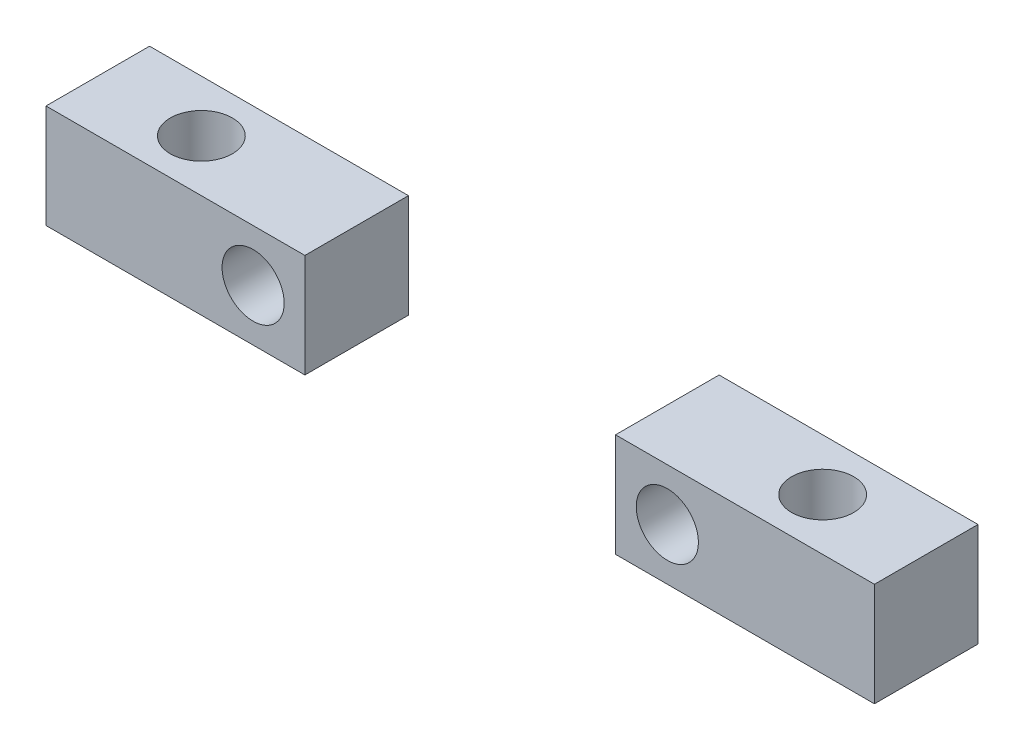
ISO-10303-21;
HEADER;
FILE_DESCRIPTION(('STEP AP214'),'2;1');
FILE_NAME('part.step','',(''),(''),'','','');
FILE_SCHEMA(('AUTOMOTIVE_DESIGN { 1 0 10303 214 1 1 1 1 }'));
ENDSEC;
DATA;
#1=APPLICATION_CONTEXT('core data for automotive mechanical design processes');
#2=APPLICATION_PROTOCOL_DEFINITION('international standard','automotive_design',2000,#1);
#3=PRODUCT_CONTEXT('',#1,'mechanical');
#4=PRODUCT('Part','Part','',(#3));
#5=PRODUCT_RELATED_PRODUCT_CATEGORY('part','',(#4));
#6=PRODUCT_DEFINITION_FORMATION('','',#4);
#7=PRODUCT_DEFINITION_CONTEXT('part definition',#1,'design');
#8=PRODUCT_DEFINITION('design','',#6,#7);
#9=PRODUCT_DEFINITION_SHAPE('','',#8);
#10=(LENGTH_UNIT() NAMED_UNIT(*) SI_UNIT(.MILLI.,.METRE.));
#11=(NAMED_UNIT(*) PLANE_ANGLE_UNIT() SI_UNIT($,.RADIAN.));
#12=(NAMED_UNIT(*) SI_UNIT($,.STERADIAN.) SOLID_ANGLE_UNIT());
#13=UNCERTAINTY_MEASURE_WITH_UNIT(LENGTH_MEASURE(1.E-05),#10,'distance_accuracy_value','');
#14=(GEOMETRIC_REPRESENTATION_CONTEXT(3) GLOBAL_UNCERTAINTY_ASSIGNED_CONTEXT((#13)) GLOBAL_UNIT_ASSIGNED_CONTEXT((#10,
#11,#12)) REPRESENTATION_CONTEXT('',''));
#15=CARTESIAN_POINT('',(0.,0.,0.));
#16=DIRECTION('',(0.,0.,1.));
#17=DIRECTION('',(1.,0.,0.));
#18=AXIS2_PLACEMENT_3D('',#15,#16,#17);
#19=CARTESIAN_POINT('',(-40.,10.,0.));
#20=DIRECTION('',(0.,0.,-1.));
#21=DIRECTION('',(-1.,0.,0.));
#22=AXIS2_PLACEMENT_3D('',#19,#20,#21);
#23=PLANE('',#22);
#24=CARTESIAN_POINT('',(-20.,4.99999999999972,0.));
#25=DIRECTION('',(0.,0.,1.));
#26=DIRECTION('',(1.,0.,0.));
#27=AXIS2_PLACEMENT_3D('',#24,#25,#26);
#28=CIRCLE('',#27,3.);
#29=CARTESIAN_POINT('',(-17.,4.99999999999972,0.));
#30=VERTEX_POINT('',#29);
#31=EDGE_CURVE('E114',#30,#30,#28,.T.);
#32=ORIENTED_EDGE('',*,*,#31,.F.);
#33=EDGE_LOOP('',(#32));
#34=FACE_BOUND('',#33,.T.);
#35=DIRECTION('',(1.,0.,0.));
#36=VECTOR('',#35,1.);
#37=CARTESIAN_POINT('',(-40.,0.,0.));
#38=LINE('',#37,#36);
#39=CARTESIAN_POINT('',(-40.,0.,0.));
#40=VERTEX_POINT('',#39);
#41=CARTESIAN_POINT('',(-15.,0.,0.));
#42=VERTEX_POINT('',#41);
#43=EDGE_CURVE('E45',#40,#42,#38,.T.);
#44=ORIENTED_EDGE('',*,*,#43,.T.);
#45=DIRECTION('',(0.,-1.,0.));
#46=VECTOR('',#45,1.);
#47=CARTESIAN_POINT('',(-15.,16.4217024320037,0.));
#48=LINE('',#47,#46);
#49=CARTESIAN_POINT('',(-15.,10.,0.));
#50=VERTEX_POINT('',#49);
#51=EDGE_CURVE('E12',#50,#42,#48,.T.);
#52=ORIENTED_EDGE('',*,*,#51,.F.);
#53=DIRECTION('',(1.,0.,0.));
#54=VECTOR('',#53,1.);
#55=CARTESIAN_POINT('',(-40.,10.,0.));
#56=LINE('',#55,#54);
#57=CARTESIAN_POINT('',(-40.,10.,0.));
#58=VERTEX_POINT('',#57);
#59=EDGE_CURVE('E87',#58,#50,#56,.T.);
#60=ORIENTED_EDGE('',*,*,#59,.F.);
#61=DIRECTION('',(0.,-1.,0.));
#62=VECTOR('',#61,1.);
#63=CARTESIAN_POINT('',(-40.,10.,0.));
#64=LINE('',#63,#62);
#65=EDGE_CURVE('E110',#58,#40,#64,.T.);
#66=ORIENTED_EDGE('',*,*,#65,.T.);
#67=EDGE_LOOP('',(#44,#52,#60,#66));
#68=FACE_BOUND('',#67,.T.);
#69=ADVANCED_FACE('F42',(#34,#68),#23,.F.);
#70=CARTESIAN_POINT('',(-40.,10.,-9.99999999999999));
#71=DIRECTION('',(0.,0.,1.));
#72=DIRECTION('',(1.,0.,0.));
#73=AXIS2_PLACEMENT_3D('',#70,#71,#72);
#74=PLANE('',#73);
#75=CARTESIAN_POINT('',(-20.,4.99999999999972,-9.99999999999999));
#76=DIRECTION('',(0.,0.,1.));
#77=DIRECTION('',(1.,0.,0.));
#78=AXIS2_PLACEMENT_3D('',#75,#76,#77);
#79=CIRCLE('',#78,3.);
#80=CARTESIAN_POINT('',(-17.,4.99999999999972,-9.99999999999999));
#81=VERTEX_POINT('',#80);
#82=EDGE_CURVE('E108',#81,#81,#79,.T.);
#83=ORIENTED_EDGE('',*,*,#82,.T.);
#84=EDGE_LOOP('',(#83));
#85=FACE_BOUND('',#84,.T.);
#86=DIRECTION('',(-1.,0.,0.));
#87=VECTOR('',#86,1.);
#88=CARTESIAN_POINT('',(-40.,10.,-9.99999999999999));
#89=LINE('',#88,#87);
#90=CARTESIAN_POINT('',(-15.,10.,-9.99999999999999));
#91=VERTEX_POINT('',#90);
#92=CARTESIAN_POINT('',(-40.,10.,-9.99999999999999));
#93=VERTEX_POINT('',#92);
#94=EDGE_CURVE('E99',#91,#93,#89,.T.);
#95=ORIENTED_EDGE('',*,*,#94,.F.);
#96=DIRECTION('',(0.,-1.,0.));
#97=VECTOR('',#96,1.);
#98=CARTESIAN_POINT('',(-15.,16.4217024320037,-9.99999999999999));
#99=LINE('',#98,#97);
#100=CARTESIAN_POINT('',(-15.,0.,-9.99999999999999));
#101=VERTEX_POINT('',#100);
#102=EDGE_CURVE('E59',#91,#101,#99,.T.);
#103=ORIENTED_EDGE('',*,*,#102,.T.);
#104=DIRECTION('',(-1.,0.,0.));
#105=VECTOR('',#104,1.);
#106=CARTESIAN_POINT('',(-40.,0.,-9.99999999999999));
#107=LINE('',#106,#105);
#108=CARTESIAN_POINT('',(-40.,0.,-9.99999999999999));
#109=VERTEX_POINT('',#108);
#110=EDGE_CURVE('E103',#101,#109,#107,.T.);
#111=ORIENTED_EDGE('',*,*,#110,.T.);
#112=DIRECTION('',(0.,-1.,0.));
#113=VECTOR('',#112,1.);
#114=CARTESIAN_POINT('',(-40.,10.,-9.99999999999999));
#115=LINE('',#114,#113);
#116=EDGE_CURVE('E117',#93,#109,#115,.T.);
#117=ORIENTED_EDGE('',*,*,#116,.F.);
#118=EDGE_LOOP('',(#95,#103,#111,#117));
#119=FACE_BOUND('',#118,.T.);
#120=ADVANCED_FACE('F129',(#85,#119),#74,.F.);
#121=CARTESIAN_POINT('',(-40.,10.,0.));
#122=DIRECTION('',(0.,1.,0.));
#123=DIRECTION('',(0.,0.,1.));
#124=AXIS2_PLACEMENT_3D('',#121,#122,#123);
#125=PLANE('',#124);
#126=DIRECTION('',(0.,0.,1.));
#127=VECTOR('',#126,1.);
#128=CARTESIAN_POINT('',(-15.,10.,0.));
#129=LINE('',#128,#127);
#130=EDGE_CURVE('E51',#91,#50,#129,.T.);
#131=ORIENTED_EDGE('',*,*,#130,.F.);
#132=ORIENTED_EDGE('',*,*,#94,.T.);
#133=DIRECTION('',(0.,0.,1.));
#134=VECTOR('',#133,1.);
#135=CARTESIAN_POINT('',(-40.,10.,-9.99999999999999));
#136=LINE('',#135,#134);
#137=EDGE_CURVE('E92',#93,#58,#136,.T.);
#138=ORIENTED_EDGE('',*,*,#137,.T.);
#139=ORIENTED_EDGE('',*,*,#59,.T.);
#140=EDGE_LOOP('',(#131,#132,#138,#139));
#141=FACE_BOUND('',#140,.T.);
#142=CARTESIAN_POINT('',(-30.,10.,-4.99999999999957));
#143=DIRECTION('',(0.,1.,0.));
#144=DIRECTION('',(0.,0.,1.));
#145=AXIS2_PLACEMENT_3D('',#142,#143,#144);
#146=CIRCLE('',#145,3.);
#147=CARTESIAN_POINT('',(-30.,10.,-1.99999999999957));
#148=VERTEX_POINT('',#147);
#149=EDGE_CURVE('E82',#148,#148,#146,.T.);
#150=ORIENTED_EDGE('',*,*,#149,.F.);
#151=EDGE_LOOP('',(#150));
#152=FACE_BOUND('',#151,.T.);
#153=ADVANCED_FACE('F89',(#141,#152),#125,.T.);
#154=CARTESIAN_POINT('',(-40.,0.,0.));
#155=DIRECTION('',(0.,1.,0.));
#156=DIRECTION('',(0.,0.,1.));
#157=AXIS2_PLACEMENT_3D('',#154,#155,#156);
#158=PLANE('',#157);
#159=CARTESIAN_POINT('',(-30.,0.,-4.99999999999957));
#160=DIRECTION('',(0.,1.,0.));
#161=DIRECTION('',(0.,0.,1.));
#162=AXIS2_PLACEMENT_3D('',#159,#160,#161);
#163=CIRCLE('',#162,3.);
#164=CARTESIAN_POINT('',(-30.,0.,-1.99999999999957));
#165=VERTEX_POINT('',#164);
#166=EDGE_CURVE('E94',#165,#165,#163,.T.);
#167=ORIENTED_EDGE('',*,*,#166,.T.);
#168=EDGE_LOOP('',(#167));
#169=FACE_BOUND('',#168,.T.);
#170=ORIENTED_EDGE('',*,*,#110,.F.);
#171=DIRECTION('',(0.,0.,1.));
#172=VECTOR('',#171,1.);
#173=CARTESIAN_POINT('',(-15.,0.,0.));
#174=LINE('',#173,#172);
#175=EDGE_CURVE('E97',#101,#42,#174,.T.);
#176=ORIENTED_EDGE('',*,*,#175,.T.);
#177=ORIENTED_EDGE('',*,*,#43,.F.);
#178=DIRECTION('',(0.,0.,1.));
#179=VECTOR('',#178,1.);
#180=CARTESIAN_POINT('',(-40.,0.,-9.99999999999999));
#181=LINE('',#180,#179);
#182=EDGE_CURVE('E119',#109,#40,#181,.T.);
#183=ORIENTED_EDGE('',*,*,#182,.F.);
#184=EDGE_LOOP('',(#170,#176,#177,#183));
#185=FACE_BOUND('',#184,.T.);
#186=ADVANCED_FACE('F125',(#169,#185),#158,.F.);
#187=CARTESIAN_POINT('',(-40.,10.,-9.99999999999999));
#188=DIRECTION('',(1.,0.,0.));
#189=DIRECTION('',(0.,0.,-1.));
#190=AXIS2_PLACEMENT_3D('',#187,#188,#189);
#191=PLANE('',#190);
#192=ORIENTED_EDGE('',*,*,#182,.T.);
#193=ORIENTED_EDGE('',*,*,#65,.F.);
#194=ORIENTED_EDGE('',*,*,#137,.F.);
#195=ORIENTED_EDGE('',*,*,#116,.T.);
#196=EDGE_LOOP('',(#192,#193,#194,#195));
#197=FACE_BOUND('',#196,.T.);
#198=ADVANCED_FACE('F128',(#197),#191,.F.);
#199=CARTESIAN_POINT('',(-20.,4.99999999999972,-9.99999999999999));
#200=DIRECTION('',(0.,0.,1.));
#201=DIRECTION('',(1.,0.,0.));
#202=AXIS2_PLACEMENT_3D('',#199,#200,#201);
#203=CYLINDRICAL_SURFACE('',#202,3.);
#204=CARTESIAN_POINT('',(-17.,4.99999999999972,-9.99999999999999));
#205=CARTESIAN_POINT('',(-17.,4.99999999999972,-9.89583333333332));
#206=CARTESIAN_POINT('',(-17.,4.99999999999972,-9.79166666666666));
#207=CARTESIAN_POINT('',(-17.,4.99999999999972,-9.58333333333332));
#208=CARTESIAN_POINT('',(-17.,4.99999999999972,-9.47916666666666));
#209=CARTESIAN_POINT('',(-17.,4.99999999999972,-9.27083333333332));
#210=CARTESIAN_POINT('',(-17.,4.99999999999972,-9.16666666666666));
#211=CARTESIAN_POINT('',(-17.,4.99999999999972,-8.95833333333332));
#212=CARTESIAN_POINT('',(-17.,4.99999999999972,-8.85416666666666));
#213=CARTESIAN_POINT('',(-17.,4.99999999999972,-8.64583333333332));
#214=CARTESIAN_POINT('',(-17.,4.99999999999972,-8.54166666666666));
#215=CARTESIAN_POINT('',(-17.,4.99999999999972,-8.33333333333333));
#216=CARTESIAN_POINT('',(-17.,4.99999999999972,-8.22916666666666));
#217=CARTESIAN_POINT('',(-17.,4.99999999999972,-8.02083333333333));
#218=CARTESIAN_POINT('',(-17.,4.99999999999972,-7.91666666666666));
#219=CARTESIAN_POINT('',(-17.,4.99999999999972,-7.70833333333333));
#220=CARTESIAN_POINT('',(-17.,4.99999999999972,-7.60416666666666));
#221=CARTESIAN_POINT('',(-17.,4.99999999999972,-7.39583333333333));
#222=CARTESIAN_POINT('',(-17.,4.99999999999972,-7.29166666666666));
#223=CARTESIAN_POINT('',(-17.,4.99999999999972,-7.08333333333333));
#224=CARTESIAN_POINT('',(-17.,4.99999999999972,-6.97916666666666));
#225=CARTESIAN_POINT('',(-17.,4.99999999999972,-6.77083333333333));
#226=CARTESIAN_POINT('',(-17.,4.99999999999972,-6.66666666666666));
#227=CARTESIAN_POINT('',(-17.,4.99999999999972,-6.45833333333333));
#228=CARTESIAN_POINT('',(-17.,4.99999999999972,-6.35416666666666));
#229=CARTESIAN_POINT('',(-17.,4.99999999999972,-6.14583333333333));
#230=CARTESIAN_POINT('',(-17.,4.99999999999972,-6.04166666666666));
#231=CARTESIAN_POINT('',(-17.,4.99999999999972,-5.83333333333333));
#232=CARTESIAN_POINT('',(-17.,4.99999999999972,-5.72916666666666));
#233=CARTESIAN_POINT('',(-17.,4.99999999999972,-5.52083333333333));
#234=CARTESIAN_POINT('',(-17.,4.99999999999972,-5.41666666666666));
#235=CARTESIAN_POINT('',(-17.,4.99999999999972,-5.20833333333333));
#236=CARTESIAN_POINT('',(-17.,4.99999999999972,-5.10416666666666));
#237=CARTESIAN_POINT('',(-17.,4.99999999999972,-4.89583333333333));
#238=CARTESIAN_POINT('',(-17.,4.99999999999972,-4.79166666666666));
#239=CARTESIAN_POINT('',(-17.,4.99999999999972,-4.58333333333333));
#240=CARTESIAN_POINT('',(-17.,4.99999999999972,-4.47916666666666));
#241=CARTESIAN_POINT('',(-17.,4.99999999999972,-4.27083333333333));
#242=CARTESIAN_POINT('',(-17.,4.99999999999972,-4.16666666666666));
#243=CARTESIAN_POINT('',(-17.,4.99999999999972,-3.95833333333333));
#244=CARTESIAN_POINT('',(-17.,4.99999999999972,-3.85416666666666));
#245=CARTESIAN_POINT('',(-17.,4.99999999999972,-3.64583333333333));
#246=CARTESIAN_POINT('',(-17.,4.99999999999972,-3.54166666666666));
#247=CARTESIAN_POINT('',(-17.,4.99999999999972,-3.33333333333333));
#248=CARTESIAN_POINT('',(-17.,4.99999999999972,-3.22916666666666));
#249=CARTESIAN_POINT('',(-17.,4.99999999999972,-3.02083333333333));
#250=CARTESIAN_POINT('',(-17.,4.99999999999972,-2.91666666666666));
#251=CARTESIAN_POINT('',(-17.,4.99999999999972,-2.70833333333333));
#252=CARTESIAN_POINT('',(-17.,4.99999999999972,-2.60416666666666));
#253=CARTESIAN_POINT('',(-17.,4.99999999999972,-2.39583333333333));
#254=CARTESIAN_POINT('',(-17.,4.99999999999972,-2.29166666666666));
#255=CARTESIAN_POINT('',(-17.,4.99999999999972,-2.08333333333333));
#256=CARTESIAN_POINT('',(-17.,4.99999999999972,-1.97916666666667));
#257=CARTESIAN_POINT('',(-17.,4.99999999999972,-1.77083333333333));
#258=CARTESIAN_POINT('',(-17.,4.99999999999972,-1.66666666666667));
#259=CARTESIAN_POINT('',(-17.,4.99999999999972,-1.45833333333333));
#260=CARTESIAN_POINT('',(-17.,4.99999999999972,-1.35416666666667));
#261=CARTESIAN_POINT('',(-17.,4.99999999999972,-1.14583333333333));
#262=CARTESIAN_POINT('',(-17.,4.99999999999972,-1.04166666666667));
#263=CARTESIAN_POINT('',(-17.,4.99999999999972,-0.833333333333334));
#264=CARTESIAN_POINT('',(-17.,4.99999999999972,-0.729166666666667));
#265=CARTESIAN_POINT('',(-17.,4.99999999999972,-0.520833333333334));
#266=CARTESIAN_POINT('',(-17.,4.99999999999972,-0.416666666666668));
#267=CARTESIAN_POINT('',(-17.,4.99999999999972,-0.208333333333335));
#268=CARTESIAN_POINT('',(-17.,4.99999999999972,-0.104166666666668));
#269=CARTESIAN_POINT('',(-17.,4.99999999999972,0.));
#270=B_SPLINE_CURVE_WITH_KNOTS('',3,(#204,#205,#206,#207,#208,#209,#210,#211,#212,#213,#214,
#215,#216,#217,#218,#219,#220,#221,#222,#223,#224,#225,#226,#227,#228,#229,#230,#231,#232,#233,
#234,#235,#236,#237,#238,#239,#240,#241,#242,#243,#244,#245,#246,#247,#248,#249,#250,#251,#252,
#253,#254,#255,#256,#257,#258,#259,#260,#261,#262,#263,#264,#265,#266,#267,#268,#269),
.UNSPECIFIED.,.F.,.F.,(4,2,2,2,2,2,2,2,2,2,2,2,2,2,2,2,2,2,2,2,2,2,2,2,2,2,2,2,2,2,2,2,4),(0.,
0.3125,0.625000000000001,0.937499999999999,1.25,1.5625,1.875,2.1875,2.5,2.8125,3.125,3.4375,
3.75,4.0625,4.375,4.6875,4.99999999999999,5.31249999999999,5.62499999999999,5.93749999999999,
6.24999999999999,6.56249999999999,6.87499999999999,7.18749999999999,7.49999999999999,
7.81249999999999,8.12499999999999,8.43749999999999,8.74999999999999,9.06249999999999,
9.37499999999999,9.68749999999999,9.99999999999999),.UNSPECIFIED.);
#271=EDGE_CURVE('BSEAM147',#81,#30,#270,.T.);
#272=ORIENTED_EDGE('',*,*,#82,.F.);
#273=ORIENTED_EDGE('',*,*,#31,.T.);
#274=ORIENTED_EDGE('',*,*,#271,.T.);
#275=ORIENTED_EDGE('',*,*,#271,.F.);
#276=EDGE_LOOP('',(#272,#274,#273,#275));
#277=FACE_BOUND('',#276,.T.);
#278=ADVANCED_FACE('F147',(#277),#203,.F.);
#279=CARTESIAN_POINT('',(-30.,0.,-4.99999999999957));
#280=DIRECTION('',(0.,1.,0.));
#281=DIRECTION('',(0.,0.,1.));
#282=AXIS2_PLACEMENT_3D('',#279,#280,#281);
#283=CYLINDRICAL_SURFACE('',#282,3.);
#284=ORIENTED_EDGE('',*,*,#166,.F.);
#285=EDGE_LOOP('',(#284));
#286=FACE_BOUND('',#285,.T.);
#287=ORIENTED_EDGE('',*,*,#149,.T.);
#288=EDGE_LOOP('',(#287));
#289=FACE_BOUND('',#288,.T.);
#290=ADVANCED_FACE('F144',(#286,#289),#283,.F.);
#291=CARTESIAN_POINT('',(-15.,16.4217024320037,-9.99999999999999));
#292=DIRECTION('',(-1.,0.,0.));
#293=DIRECTION('',(0.,-1.,0.));
#294=AXIS2_PLACEMENT_3D('',#291,#292,#293);
#295=PLANE('',#294);
#296=ORIENTED_EDGE('',*,*,#130,.T.);
#297=ORIENTED_EDGE('',*,*,#51,.T.);
#298=ORIENTED_EDGE('',*,*,#175,.F.);
#299=ORIENTED_EDGE('',*,*,#102,.F.);
#300=EDGE_LOOP('',(#296,#297,#298,#299));
#301=FACE_BOUND('',#300,.T.);
#302=ADVANCED_FACE('F78',(#301),#295,.F.);
#303=CLOSED_SHELL('',(#69,#120,#153,#186,#198,#278,#290,#302));
#304=MANIFOLD_SOLID_BREP('B2',#303);
#305=CARTESIAN_POINT('',(20.,5.,-9.99999999999999));
#306=DIRECTION('',(0.,0.,1.));
#307=DIRECTION('',(1.,0.,0.));
#308=AXIS2_PLACEMENT_3D('',#305,#306,#307);
#309=CYLINDRICAL_SURFACE('',#308,3.);
#310=CARTESIAN_POINT('',(20.,5.,-9.99999999999999));
#311=DIRECTION('',(0.,0.,1.));
#312=DIRECTION('',(1.,0.,0.));
#313=AXIS2_PLACEMENT_3D('',#310,#311,#312);
#314=CIRCLE('',#313,3.);
#315=CARTESIAN_POINT('',(23.,5.,-9.99999999999999));
#316=VERTEX_POINT('',#315);
#317=EDGE_CURVE('E266',#316,#316,#314,.T.);
#318=CARTESIAN_POINT('',(20.,5.,0.));
#319=DIRECTION('',(0.,0.,1.));
#320=DIRECTION('',(1.,0.,0.));
#321=AXIS2_PLACEMENT_3D('',#318,#319,#320);
#322=CIRCLE('',#321,3.);
#323=CARTESIAN_POINT('',(23.,5.,0.));
#324=VERTEX_POINT('',#323);
#325=EDGE_CURVE('E269',#324,#324,#322,.T.);
#326=CARTESIAN_POINT('',(23.,5.,-9.99999999999999));
#327=CARTESIAN_POINT('',(23.,5.,-9.89583333333332));
#328=CARTESIAN_POINT('',(23.,5.,-9.79166666666666));
#329=CARTESIAN_POINT('',(23.,5.,-9.58333333333332));
#330=CARTESIAN_POINT('',(23.,5.,-9.47916666666666));
#331=CARTESIAN_POINT('',(23.,5.,-9.27083333333332));
#332=CARTESIAN_POINT('',(23.,5.,-9.16666666666666));
#333=CARTESIAN_POINT('',(23.,5.,-8.95833333333332));
#334=CARTESIAN_POINT('',(23.,5.,-8.85416666666666));
#335=CARTESIAN_POINT('',(23.,5.,-8.64583333333332));
#336=CARTESIAN_POINT('',(23.,5.,-8.54166666666666));
#337=CARTESIAN_POINT('',(23.,5.,-8.33333333333333));
#338=CARTESIAN_POINT('',(23.,5.,-8.22916666666666));
#339=CARTESIAN_POINT('',(23.,5.,-8.02083333333333));
#340=CARTESIAN_POINT('',(23.,5.,-7.91666666666666));
#341=CARTESIAN_POINT('',(23.,5.,-7.70833333333333));
#342=CARTESIAN_POINT('',(23.,5.,-7.60416666666666));
#343=CARTESIAN_POINT('',(23.,5.,-7.39583333333333));
#344=CARTESIAN_POINT('',(23.,5.,-7.29166666666666));
#345=CARTESIAN_POINT('',(23.,5.,-7.08333333333333));
#346=CARTESIAN_POINT('',(23.,5.,-6.97916666666666));
#347=CARTESIAN_POINT('',(23.,5.,-6.77083333333333));
#348=CARTESIAN_POINT('',(23.,5.,-6.66666666666666));
#349=CARTESIAN_POINT('',(23.,5.,-6.45833333333333));
#350=CARTESIAN_POINT('',(23.,5.,-6.35416666666666));
#351=CARTESIAN_POINT('',(23.,5.,-6.14583333333333));
#352=CARTESIAN_POINT('',(23.,5.,-6.04166666666666));
#353=CARTESIAN_POINT('',(23.,5.,-5.83333333333333));
#354=CARTESIAN_POINT('',(23.,5.,-5.72916666666666));
#355=CARTESIAN_POINT('',(23.,5.,-5.52083333333333));
#356=CARTESIAN_POINT('',(23.,5.,-5.41666666666666));
#357=CARTESIAN_POINT('',(23.,5.,-5.20833333333333));
#358=CARTESIAN_POINT('',(23.,5.,-5.10416666666666));
#359=CARTESIAN_POINT('',(23.,5.,-4.89583333333333));
#360=CARTESIAN_POINT('',(23.,5.,-4.79166666666666));
#361=CARTESIAN_POINT('',(23.,5.,-4.58333333333333));
#362=CARTESIAN_POINT('',(23.,5.,-4.47916666666666));
#363=CARTESIAN_POINT('',(23.,5.,-4.27083333333333));
#364=CARTESIAN_POINT('',(23.,5.,-4.16666666666666));
#365=CARTESIAN_POINT('',(23.,5.,-3.95833333333333));
#366=CARTESIAN_POINT('',(23.,5.,-3.85416666666666));
#367=CARTESIAN_POINT('',(23.,5.,-3.64583333333333));
#368=CARTESIAN_POINT('',(23.,5.,-3.54166666666666));
#369=CARTESIAN_POINT('',(23.,5.,-3.33333333333333));
#370=CARTESIAN_POINT('',(23.,5.,-3.22916666666666));
#371=CARTESIAN_POINT('',(23.,5.,-3.02083333333333));
#372=CARTESIAN_POINT('',(23.,5.,-2.91666666666666));
#373=CARTESIAN_POINT('',(23.,5.,-2.70833333333333));
#374=CARTESIAN_POINT('',(23.,5.,-2.60416666666666));
#375=CARTESIAN_POINT('',(23.,5.,-2.39583333333333));
#376=CARTESIAN_POINT('',(23.,5.,-2.29166666666666));
#377=CARTESIAN_POINT('',(23.,5.,-2.08333333333333));
#378=CARTESIAN_POINT('',(23.,5.,-1.97916666666667));
#379=CARTESIAN_POINT('',(23.,5.,-1.77083333333333));
#380=CARTESIAN_POINT('',(23.,5.,-1.66666666666667));
#381=CARTESIAN_POINT('',(23.,5.,-1.45833333333333));
#382=CARTESIAN_POINT('',(23.,5.,-1.35416666666667));
#383=CARTESIAN_POINT('',(23.,5.,-1.14583333333333));
#384=CARTESIAN_POINT('',(23.,5.,-1.04166666666667));
#385=CARTESIAN_POINT('',(23.,5.,-0.833333333333334));
#386=CARTESIAN_POINT('',(23.,5.,-0.729166666666667));
#387=CARTESIAN_POINT('',(23.,5.,-0.520833333333334));
#388=CARTESIAN_POINT('',(23.,5.,-0.416666666666668));
#389=CARTESIAN_POINT('',(23.,5.,-0.208333333333335));
#390=CARTESIAN_POINT('',(23.,5.,-0.104166666666668));
#391=CARTESIAN_POINT('',(23.,5.,0.));
#392=B_SPLINE_CURVE_WITH_KNOTS('',3,(#326,#327,#328,#329,#330,#331,#332,#333,#334,#335,#336,
#337,#338,#339,#340,#341,#342,#343,#344,#345,#346,#347,#348,#349,#350,#351,#352,#353,#354,#355,
#356,#357,#358,#359,#360,#361,#362,#363,#364,#365,#366,#367,#368,#369,#370,#371,#372,#373,#374,
#375,#376,#377,#378,#379,#380,#381,#382,#383,#384,#385,#386,#387,#388,#389,#390,#391),
.UNSPECIFIED.,.F.,.F.,(4,2,2,2,2,2,2,2,2,2,2,2,2,2,2,2,2,2,2,2,2,2,2,2,2,2,2,2,2,2,2,2,4),(0.,
0.3125,0.625000000000001,0.937499999999999,1.25,1.5625,1.875,2.1875,2.5,2.8125,3.125,3.4375,
3.75,4.0625,4.375,4.6875,4.99999999999999,5.31249999999999,5.62499999999999,5.93749999999999,
6.24999999999999,6.56249999999999,6.87499999999999,7.18749999999999,7.49999999999999,
7.81249999999999,8.12499999999999,8.43749999999999,8.74999999999999,9.06249999999999,
9.37499999999999,9.68749999999999,9.99999999999999),.UNSPECIFIED.);
#393=EDGE_CURVE('BSEAM207',#316,#324,#392,.T.);
#394=ORIENTED_EDGE('',*,*,#317,.F.);
#395=ORIENTED_EDGE('',*,*,#325,.T.);
#396=ORIENTED_EDGE('',*,*,#393,.T.);
#397=ORIENTED_EDGE('',*,*,#393,.F.);
#398=EDGE_LOOP('',(#394,#396,#395,#397));
#399=FACE_BOUND('',#398,.T.);
#400=ADVANCED_FACE('F207',(#399),#309,.F.);
#401=CARTESIAN_POINT('',(40.,10.,-9.99999999999999));
#402=DIRECTION('',(-1.,0.,0.));
#403=DIRECTION('',(0.,0.,1.));
#404=AXIS2_PLACEMENT_3D('',#401,#402,#403);
#405=PLANE('',#404);
#406=DIRECTION('',(0.,0.,-1.));
#407=VECTOR('',#406,1.);
#408=CARTESIAN_POINT('',(40.,0.,-9.99999999999999));
#409=LINE('',#408,#407);
#410=CARTESIAN_POINT('',(40.,0.,0.));
#411=VERTEX_POINT('',#410);
#412=CARTESIAN_POINT('',(40.,0.,-9.99999999999999));
#413=VERTEX_POINT('',#412);
#414=EDGE_CURVE('E243',#411,#413,#409,.T.);
#415=ORIENTED_EDGE('',*,*,#414,.T.);
#416=DIRECTION('',(0.,-1.,0.));
#417=VECTOR('',#416,1.);
#418=CARTESIAN_POINT('',(40.,10.,-9.99999999999999));
#419=LINE('',#418,#417);
#420=CARTESIAN_POINT('',(40.,10.,-9.99999999999999));
#421=VERTEX_POINT('',#420);
#422=EDGE_CURVE('E246',#421,#413,#419,.T.);
#423=ORIENTED_EDGE('',*,*,#422,.F.);
#424=DIRECTION('',(0.,0.,-1.));
#425=VECTOR('',#424,1.);
#426=CARTESIAN_POINT('',(40.,10.,-9.99999999999999));
#427=LINE('',#426,#425);
#428=CARTESIAN_POINT('',(40.,10.,0.));
#429=VERTEX_POINT('',#428);
#430=EDGE_CURVE('E230',#429,#421,#427,.T.);
#431=ORIENTED_EDGE('',*,*,#430,.F.);
#432=DIRECTION('',(0.,-1.,0.));
#433=VECTOR('',#432,1.);
#434=CARTESIAN_POINT('',(40.,10.,0.));
#435=LINE('',#434,#433);
#436=EDGE_CURVE('E215',#429,#411,#435,.T.);
#437=ORIENTED_EDGE('',*,*,#436,.T.);
#438=EDGE_LOOP('',(#415,#423,#431,#437));
#439=FACE_BOUND('',#438,.T.);
#440=ADVANCED_FACE('F245',(#439),#405,.F.);
#441=CARTESIAN_POINT('',(30.,0.,-4.99999999999999));
#442=DIRECTION('',(0.,1.,0.));
#443=DIRECTION('',(0.,0.,1.));
#444=AXIS2_PLACEMENT_3D('',#441,#442,#443);
#445=CYLINDRICAL_SURFACE('',#444,3.);
#446=CARTESIAN_POINT('',(30.,0.,-4.99999999999999));
#447=DIRECTION('',(0.,1.,0.));
#448=DIRECTION('',(0.,0.,1.));
#449=AXIS2_PLACEMENT_3D('',#446,#447,#448);
#450=CIRCLE('',#449,3.);
#451=CARTESIAN_POINT('',(30.,0.,-1.99999999999999));
#452=VERTEX_POINT('',#451);
#453=EDGE_CURVE('E272',#452,#452,#450,.T.);
#454=ORIENTED_EDGE('',*,*,#453,.F.);
#455=EDGE_LOOP('',(#454));
#456=FACE_BOUND('',#455,.T.);
#457=CARTESIAN_POINT('',(30.,10.,-4.99999999999999));
#458=DIRECTION('',(0.,1.,0.));
#459=DIRECTION('',(0.,0.,1.));
#460=AXIS2_PLACEMENT_3D('',#457,#458,#459);
#461=CIRCLE('',#460,3.);
#462=CARTESIAN_POINT('',(30.,10.,-1.99999999999999));
#463=VERTEX_POINT('',#462);
#464=EDGE_CURVE('E275',#463,#463,#461,.T.);
#465=ORIENTED_EDGE('',*,*,#464,.T.);
#466=EDGE_LOOP('',(#465));
#467=FACE_BOUND('',#466,.T.);
#468=ADVANCED_FACE('F309',(#456,#467),#445,.F.);
#469=CARTESIAN_POINT('',(-40.,10.,0.));
#470=DIRECTION('',(0.,1.,0.));
#471=DIRECTION('',(0.,0.,1.));
#472=AXIS2_PLACEMENT_3D('',#469,#470,#471);
#473=PLANE('',#472);
#474=DIRECTION('',(0.,0.,-1.));
#475=VECTOR('',#474,1.);
#476=CARTESIAN_POINT('',(15.,10.,0.));
#477=LINE('',#476,#475);
#478=CARTESIAN_POINT('',(15.,10.,0.));
#479=VERTEX_POINT('',#478);
#480=CARTESIAN_POINT('',(15.,10.,-9.99999999999999));
#481=VERTEX_POINT('',#480);
#482=EDGE_CURVE('E278',#479,#481,#477,.T.);
#483=ORIENTED_EDGE('',*,*,#482,.F.);
#484=DIRECTION('',(1.,0.,0.));
#485=VECTOR('',#484,1.);
#486=CARTESIAN_POINT('',(-40.,10.,0.));
#487=LINE('',#486,#485);
#488=EDGE_CURVE('E261',#479,#429,#487,.T.);
#489=ORIENTED_EDGE('',*,*,#488,.T.);
#490=ORIENTED_EDGE('',*,*,#430,.T.);
#491=DIRECTION('',(-1.,0.,0.));
#492=VECTOR('',#491,1.);
#493=CARTESIAN_POINT('',(-40.,10.,-9.99999999999999));
#494=LINE('',#493,#492);
#495=EDGE_CURVE('E258',#421,#481,#494,.T.);
#496=ORIENTED_EDGE('',*,*,#495,.T.);
#497=EDGE_LOOP('',(#483,#489,#490,#496));
#498=FACE_BOUND('',#497,.T.);
#499=ORIENTED_EDGE('',*,*,#464,.F.);
#500=EDGE_LOOP('',(#499));
#501=FACE_BOUND('',#500,.T.);
#502=ADVANCED_FACE('F287',(#498,#501),#473,.T.);
#503=CARTESIAN_POINT('',(-40.,0.,0.));
#504=DIRECTION('',(0.,1.,0.));
#505=DIRECTION('',(0.,0.,1.));
#506=AXIS2_PLACEMENT_3D('',#503,#504,#505);
#507=PLANE('',#506);
#508=ORIENTED_EDGE('',*,*,#453,.T.);
#509=EDGE_LOOP('',(#508));
#510=FACE_BOUND('',#509,.T.);
#511=DIRECTION('',(1.,0.,0.));
#512=VECTOR('',#511,1.);
#513=CARTESIAN_POINT('',(-40.,0.,0.));
#514=LINE('',#513,#512);
#515=CARTESIAN_POINT('',(15.,0.,0.));
#516=VERTEX_POINT('',#515);
#517=EDGE_CURVE('E253',#516,#411,#514,.T.);
#518=ORIENTED_EDGE('',*,*,#517,.F.);
#519=DIRECTION('',(0.,0.,-1.));
#520=VECTOR('',#519,1.);
#521=CARTESIAN_POINT('',(15.,0.,0.));
#522=LINE('',#521,#520);
#523=CARTESIAN_POINT('',(15.,0.,-9.99999999999999));
#524=VERTEX_POINT('',#523);
#525=EDGE_CURVE('E40',#516,#524,#522,.T.);
#526=ORIENTED_EDGE('',*,*,#525,.T.);
#527=DIRECTION('',(-1.,0.,0.));
#528=VECTOR('',#527,1.);
#529=CARTESIAN_POINT('',(-40.,0.,-9.99999999999999));
#530=LINE('',#529,#528);
#531=EDGE_CURVE('E252',#413,#524,#530,.T.);
#532=ORIENTED_EDGE('',*,*,#531,.F.);
#533=ORIENTED_EDGE('',*,*,#414,.F.);
#534=EDGE_LOOP('',(#518,#526,#532,#533));
#535=FACE_BOUND('',#534,.T.);
#536=ADVANCED_FACE('F260',(#510,#535),#507,.F.);
#537=CARTESIAN_POINT('',(-40.,10.,-9.99999999999999));
#538=DIRECTION('',(0.,0.,1.));
#539=DIRECTION('',(1.,0.,0.));
#540=AXIS2_PLACEMENT_3D('',#537,#538,#539);
#541=PLANE('',#540);
#542=ORIENTED_EDGE('',*,*,#317,.T.);
#543=EDGE_LOOP('',(#542));
#544=FACE_BOUND('',#543,.T.);
#545=ORIENTED_EDGE('',*,*,#531,.T.);
#546=DIRECTION('',(0.,1.,0.));
#547=VECTOR('',#546,1.);
#548=CARTESIAN_POINT('',(15.,16.4217024320037,-9.99999999999999));
#549=LINE('',#548,#547);
#550=EDGE_CURVE('E222',#524,#481,#549,.T.);
#551=ORIENTED_EDGE('',*,*,#550,.T.);
#552=ORIENTED_EDGE('',*,*,#495,.F.);
#553=ORIENTED_EDGE('',*,*,#422,.T.);
#554=EDGE_LOOP('',(#545,#551,#552,#553));
#555=FACE_BOUND('',#554,.T.);
#556=ADVANCED_FACE('F257',(#544,#555),#541,.F.);
#557=CARTESIAN_POINT('',(-40.,10.,0.));
#558=DIRECTION('',(0.,0.,-1.));
#559=DIRECTION('',(-1.,0.,0.));
#560=AXIS2_PLACEMENT_3D('',#557,#558,#559);
#561=PLANE('',#560);
#562=ORIENTED_EDGE('',*,*,#325,.F.);
#563=EDGE_LOOP('',(#562));
#564=FACE_BOUND('',#563,.T.);
#565=ORIENTED_EDGE('',*,*,#488,.F.);
#566=DIRECTION('',(0.,1.,0.));
#567=VECTOR('',#566,1.);
#568=CARTESIAN_POINT('',(15.,16.4217024320037,0.));
#569=LINE('',#568,#567);
#570=EDGE_CURVE('E282',#516,#479,#569,.T.);
#571=ORIENTED_EDGE('',*,*,#570,.F.);
#572=ORIENTED_EDGE('',*,*,#517,.T.);
#573=ORIENTED_EDGE('',*,*,#436,.F.);
#574=EDGE_LOOP('',(#565,#571,#572,#573));
#575=FACE_BOUND('',#574,.T.);
#576=ADVANCED_FACE('F209',(#564,#575),#561,.F.);
#577=CARTESIAN_POINT('',(15.,16.4217024320037,-9.99999999999999));
#578=DIRECTION('',(1.,0.,0.));
#579=DIRECTION('',(0.,1.,0.));
#580=AXIS2_PLACEMENT_3D('',#577,#578,#579);
#581=PLANE('',#580);
#582=ORIENTED_EDGE('',*,*,#482,.T.);
#583=ORIENTED_EDGE('',*,*,#550,.F.);
#584=ORIENTED_EDGE('',*,*,#525,.F.);
#585=ORIENTED_EDGE('',*,*,#570,.T.);
#586=EDGE_LOOP('',(#582,#583,#584,#585));
#587=FACE_BOUND('',#586,.T.);
#588=ADVANCED_FACE('F295',(#587),#581,.F.);
#589=CLOSED_SHELL('',(#400,#440,#468,#502,#536,#556,#576,#588));
#590=MANIFOLD_SOLID_BREP('B6',#589);
#591=ADVANCED_BREP_SHAPE_REPRESENTATION('',(#18,#304,#590),#14);
#592=SHAPE_DEFINITION_REPRESENTATION(#9,#591);
ENDSEC;
END-ISO-10303-21;
